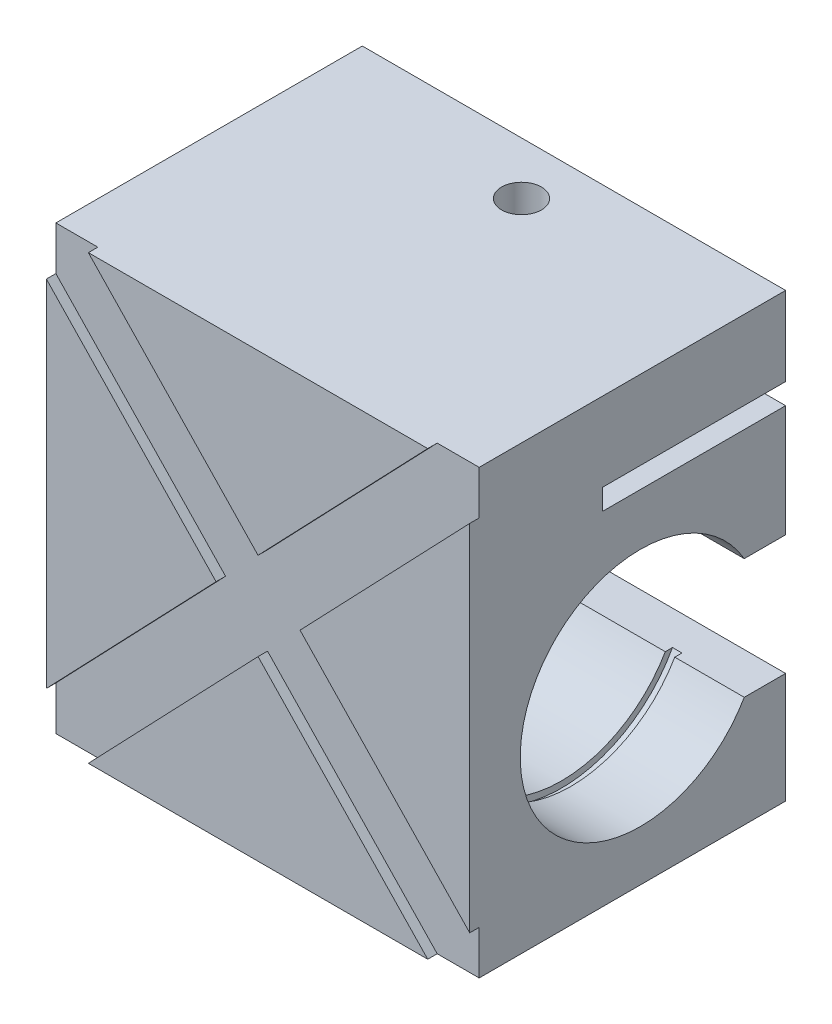
ISO-10303-21;
HEADER;
FILE_DESCRIPTION(('STEP AP214'),'2;1');
FILE_NAME('part.step','',(''),(''),'','','');
FILE_SCHEMA(('AUTOMOTIVE_DESIGN { 1 0 10303 214 1 1 1 1 }'));
ENDSEC;
DATA;
#1=APPLICATION_CONTEXT('core data for automotive mechanical design processes');
#2=APPLICATION_PROTOCOL_DEFINITION('international standard','automotive_design',2000,#1);
#3=PRODUCT_CONTEXT('',#1,'mechanical');
#4=PRODUCT('Part','Part','',(#3));
#5=PRODUCT_RELATED_PRODUCT_CATEGORY('part','',(#4));
#6=PRODUCT_DEFINITION_FORMATION('','',#4);
#7=PRODUCT_DEFINITION_CONTEXT('part definition',#1,'design');
#8=PRODUCT_DEFINITION('design','',#6,#7);
#9=PRODUCT_DEFINITION_SHAPE('','',#8);
#10=(LENGTH_UNIT() NAMED_UNIT(*) SI_UNIT(.MILLI.,.METRE.));
#11=(NAMED_UNIT(*) PLANE_ANGLE_UNIT() SI_UNIT($,.RADIAN.));
#12=(NAMED_UNIT(*) SI_UNIT($,.STERADIAN.) SOLID_ANGLE_UNIT());
#13=UNCERTAINTY_MEASURE_WITH_UNIT(LENGTH_MEASURE(1.E-05),#10,'distance_accuracy_value','');
#14=(GEOMETRIC_REPRESENTATION_CONTEXT(3) GLOBAL_UNCERTAINTY_ASSIGNED_CONTEXT((#13)) GLOBAL_UNIT_ASSIGNED_CONTEXT((#10,
#11,#12)) REPRESENTATION_CONTEXT('',''));
#15=CARTESIAN_POINT('',(0.,0.,0.));
#16=DIRECTION('',(0.,0.,1.));
#17=DIRECTION('',(1.,0.,0.));
#18=AXIS2_PLACEMENT_3D('',#15,#16,#17);
#19=CARTESIAN_POINT('',(0.,70.,0.));
#20=DIRECTION('',(1.,0.,0.));
#21=DIRECTION('',(0.,0.,-1.));
#22=AXIS2_PLACEMENT_3D('',#19,#20,#21);
#23=PLANE('',#22);
#24=DIRECTION('',(0.,-1.,0.));
#25=VECTOR('',#24,1.);
#26=CARTESIAN_POINT('',(0.,70.,0.));
#27=LINE('',#26,#25);
#28=CARTESIAN_POINT('',(0.,63.0581359493212,0.));
#29=VERTEX_POINT('',#28);
#30=CARTESIAN_POINT('',(0.,6.94186405067879,0.));
#31=VERTEX_POINT('',#30);
#32=EDGE_CURVE('E459',#29,#31,#27,.T.);
#33=ORIENTED_EDGE('',*,*,#32,.F.);
#34=DIRECTION('',(0.,0.,1.));
#35=VECTOR('',#34,1.);
#36=CARTESIAN_POINT('',(0.,63.0581359493212,-1.5));
#37=LINE('',#36,#35);
#38=CARTESIAN_POINT('',(0.,63.0581359493212,-1.5));
#39=VERTEX_POINT('',#38);
#40=EDGE_CURVE('E333',#39,#29,#37,.T.);
#41=ORIENTED_EDGE('',*,*,#40,.F.);
#42=DIRECTION('',(0.,-1.,0.));
#43=VECTOR('',#42,1.);
#44=CARTESIAN_POINT('',(0.,0.,-1.5));
#45=LINE('',#44,#43);
#46=CARTESIAN_POINT('',(0.,70.,-1.5));
#47=VERTEX_POINT('',#46);
#48=EDGE_CURVE('E282',#47,#39,#45,.T.);
#49=ORIENTED_EDGE('',*,*,#48,.F.);
#50=DIRECTION('',(0.,0.,1.));
#51=VECTOR('',#50,1.);
#52=CARTESIAN_POINT('',(0.,70.,0.));
#53=LINE('',#52,#51);
#54=CARTESIAN_POINT('',(0.,70.,-50.));
#55=VERTEX_POINT('',#54);
#56=EDGE_CURVE('E426',#55,#47,#53,.T.);
#57=ORIENTED_EDGE('',*,*,#56,.F.);
#58=DIRECTION('',(0.,-1.,0.));
#59=VECTOR('',#58,1.);
#60=CARTESIAN_POINT('',(0.,70.,-50.));
#61=LINE('',#60,#59);
#62=CARTESIAN_POINT('',(0.,57.5,-50.));
#63=VERTEX_POINT('',#62);
#64=EDGE_CURVE('E447',#55,#63,#61,.T.);
#65=ORIENTED_EDGE('',*,*,#64,.T.);
#66=DIRECTION('',(0.,0.,1.));
#67=VECTOR('',#66,1.);
#68=CARTESIAN_POINT('',(0.,57.5,0.));
#69=LINE('',#68,#67);
#70=CARTESIAN_POINT('',(0.,57.5,-21.));
#71=VERTEX_POINT('',#70);
#72=EDGE_CURVE('E388',#63,#71,#69,.T.);
#73=ORIENTED_EDGE('',*,*,#72,.T.);
#74=DIRECTION('',(0.,-1.,0.));
#75=VECTOR('',#74,1.);
#76=CARTESIAN_POINT('',(0.,70.,-21.));
#77=LINE('',#76,#75);
#78=CARTESIAN_POINT('',(0.,54.2,-21.));
#79=VERTEX_POINT('',#78);
#80=EDGE_CURVE('E395',#71,#79,#77,.T.);
#81=ORIENTED_EDGE('',*,*,#80,.T.);
#82=DIRECTION('',(0.,0.,-1.));
#83=VECTOR('',#82,1.);
#84=CARTESIAN_POINT('',(0.,54.2,0.));
#85=LINE('',#84,#83);
#86=CARTESIAN_POINT('',(0.,54.2,-50.));
#87=VERTEX_POINT('',#86);
#88=EDGE_CURVE('E392',#79,#87,#85,.T.);
#89=ORIENTED_EDGE('',*,*,#88,.T.);
#90=CARTESIAN_POINT('',(0.,36.5,-50.));
#91=VERTEX_POINT('',#90);
#92=EDGE_CURVE('E451',#87,#91,#61,.T.);
#93=ORIENTED_EDGE('',*,*,#92,.T.);
#94=DIRECTION('',(0.,0.,-1.));
#95=VECTOR('',#94,1.);
#96=CARTESIAN_POINT('',(0.,36.5,0.));
#97=LINE('',#96,#95);
#98=CARTESIAN_POINT('',(0.,36.5,-43.4544826719043));
#99=VERTEX_POINT('',#98);
#100=EDGE_CURVE('E419',#99,#91,#97,.T.);
#101=ORIENTED_EDGE('',*,*,#100,.F.);
#102=CARTESIAN_POINT('',(0.,27.,-27.));
#103=DIRECTION('',(1.,0.,0.));
#104=DIRECTION('',(0.,0.,-1.));
#105=AXIS2_PLACEMENT_3D('',#102,#103,#104);
#106=CIRCLE('',#105,19.);
#107=CARTESIAN_POINT('',(0.,17.5,-43.4544826719043));
#108=VERTEX_POINT('',#107);
#109=EDGE_CURVE('E422',#99,#108,#106,.T.);
#110=ORIENTED_EDGE('',*,*,#109,.T.);
#111=DIRECTION('',(0.,0.,-1.));
#112=VECTOR('',#111,1.);
#113=CARTESIAN_POINT('',(0.,17.5,0.));
#114=LINE('',#113,#112);
#115=CARTESIAN_POINT('',(0.,17.5,-50.));
#116=VERTEX_POINT('',#115);
#117=EDGE_CURVE('E410',#108,#116,#114,.T.);
#118=ORIENTED_EDGE('',*,*,#117,.T.);
#119=CARTESIAN_POINT('',(0.,0.,-50.));
#120=VERTEX_POINT('',#119);
#121=EDGE_CURVE('E437',#116,#120,#61,.T.);
#122=ORIENTED_EDGE('',*,*,#121,.T.);
#123=DIRECTION('',(0.,0.,1.));
#124=VECTOR('',#123,1.);
#125=CARTESIAN_POINT('',(0.,0.,0.));
#126=LINE('',#125,#124);
#127=CARTESIAN_POINT('',(0.,0.,-1.5));
#128=VERTEX_POINT('',#127);
#129=EDGE_CURVE('E425',#120,#128,#126,.T.);
#130=ORIENTED_EDGE('',*,*,#129,.T.);
#131=CARTESIAN_POINT('',(0.,6.94186405067879,-1.5));
#132=VERTEX_POINT('',#131);
#133=EDGE_CURVE('E51',#132,#128,#45,.T.);
#134=ORIENTED_EDGE('',*,*,#133,.F.);
#135=DIRECTION('',(0.,0.,1.));
#136=VECTOR('',#135,1.);
#137=CARTESIAN_POINT('',(0.,6.94186405067879,-1.5));
#138=LINE('',#137,#136);
#139=EDGE_CURVE('E328',#132,#31,#138,.T.);
#140=ORIENTED_EDGE('',*,*,#139,.T.);
#141=EDGE_LOOP('',(#33,#41,#49,#57,#65,#73,#81,#89,#93,#101,#110,#118,#122,#130,#134,#140));
#142=FACE_BOUND('',#141,.T.);
#143=ADVANCED_FACE('F37',(#142),#23,.F.);
#144=CARTESIAN_POINT('',(67.,70.,0.));
#145=DIRECTION('',(-1.,0.,0.));
#146=DIRECTION('',(0.,0.,1.));
#147=AXIS2_PLACEMENT_3D('',#144,#145,#146);
#148=PLANE('',#147);
#149=DIRECTION('',(0.,0.,1.));
#150=VECTOR('',#149,1.);
#151=CARTESIAN_POINT('',(67.,6.94186405067873,-1.5));
#152=LINE('',#151,#150);
#153=CARTESIAN_POINT('',(67.,6.94186405067873,-1.5));
#154=VERTEX_POINT('',#153);
#155=CARTESIAN_POINT('',(67.,6.94186405067873,0.));
#156=VERTEX_POINT('',#155);
#157=EDGE_CURVE('E318',#154,#156,#152,.T.);
#158=ORIENTED_EDGE('',*,*,#157,.F.);
#159=DIRECTION('',(0.,1.,0.));
#160=VECTOR('',#159,1.);
#161=CARTESIAN_POINT('',(67.,0.,-1.5));
#162=LINE('',#161,#160);
#163=CARTESIAN_POINT('',(67.,0.,-1.5));
#164=VERTEX_POINT('',#163);
#165=EDGE_CURVE('E256',#164,#154,#162,.T.);
#166=ORIENTED_EDGE('',*,*,#165,.F.);
#167=DIRECTION('',(0.,0.,-1.));
#168=VECTOR('',#167,1.);
#169=CARTESIAN_POINT('',(67.,0.,0.));
#170=LINE('',#169,#168);
#171=CARTESIAN_POINT('',(67.,0.,-50.));
#172=VERTEX_POINT('',#171);
#173=EDGE_CURVE('E443',#164,#172,#170,.T.);
#174=ORIENTED_EDGE('',*,*,#173,.T.);
#175=DIRECTION('',(0.,-1.,0.));
#176=VECTOR('',#175,1.);
#177=CARTESIAN_POINT('',(67.,70.,-50.));
#178=LINE('',#177,#176);
#179=CARTESIAN_POINT('',(67.,17.5,-50.));
#180=VERTEX_POINT('',#179);
#181=EDGE_CURVE('E450',#180,#172,#178,.T.);
#182=ORIENTED_EDGE('',*,*,#181,.F.);
#183=DIRECTION('',(0.,0.,-1.));
#184=VECTOR('',#183,1.);
#185=CARTESIAN_POINT('',(67.,17.5,0.));
#186=LINE('',#185,#184);
#187=CARTESIAN_POINT('',(67.,17.5,-43.4544826719043));
#188=VERTEX_POINT('',#187);
#189=EDGE_CURVE('E404',#188,#180,#186,.T.);
#190=ORIENTED_EDGE('',*,*,#189,.F.);
#191=CARTESIAN_POINT('',(67.,27.,-27.));
#192=DIRECTION('',(1.,0.,0.));
#193=DIRECTION('',(0.,0.,-1.));
#194=AXIS2_PLACEMENT_3D('',#191,#192,#193);
#195=CIRCLE('',#194,19.);
#196=CARTESIAN_POINT('',(67.,36.5,-43.4544826719043));
#197=VERTEX_POINT('',#196);
#198=EDGE_CURVE('E401',#197,#188,#195,.T.);
#199=ORIENTED_EDGE('',*,*,#198,.F.);
#200=DIRECTION('',(0.,0.,-1.));
#201=VECTOR('',#200,1.);
#202=CARTESIAN_POINT('',(67.,36.5,0.));
#203=LINE('',#202,#201);
#204=CARTESIAN_POINT('',(67.,36.5,-50.));
#205=VERTEX_POINT('',#204);
#206=EDGE_CURVE('E398',#197,#205,#203,.T.);
#207=ORIENTED_EDGE('',*,*,#206,.T.);
#208=CARTESIAN_POINT('',(67.,54.2,-50.));
#209=VERTEX_POINT('',#208);
#210=EDGE_CURVE('E456',#209,#205,#178,.T.);
#211=ORIENTED_EDGE('',*,*,#210,.F.);
#212=DIRECTION('',(0.,0.,-1.));
#213=VECTOR('',#212,1.);
#214=CARTESIAN_POINT('',(67.,54.2,-56.1986039492968));
#215=LINE('',#214,#213);
#216=CARTESIAN_POINT('',(67.,54.2,-21.));
#217=VERTEX_POINT('',#216);
#218=EDGE_CURVE('E383',#217,#209,#215,.T.);
#219=ORIENTED_EDGE('',*,*,#218,.F.);
#220=DIRECTION('',(0.,-1.,0.));
#221=VECTOR('',#220,1.);
#222=CARTESIAN_POINT('',(67.,57.5,-21.));
#223=LINE('',#222,#221);
#224=CARTESIAN_POINT('',(67.,57.5,-21.));
#225=VERTEX_POINT('',#224);
#226=EDGE_CURVE('E380',#225,#217,#223,.T.);
#227=ORIENTED_EDGE('',*,*,#226,.F.);
#228=DIRECTION('',(0.,0.,1.));
#229=VECTOR('',#228,1.);
#230=CARTESIAN_POINT('',(67.,57.5,-50.));
#231=LINE('',#230,#229);
#232=CARTESIAN_POINT('',(67.,57.5,-50.));
#233=VERTEX_POINT('',#232);
#234=EDGE_CURVE('E377',#233,#225,#231,.T.);
#235=ORIENTED_EDGE('',*,*,#234,.F.);
#236=CARTESIAN_POINT('',(67.,70.,-50.));
#237=VERTEX_POINT('',#236);
#238=EDGE_CURVE('E452',#237,#233,#178,.T.);
#239=ORIENTED_EDGE('',*,*,#238,.F.);
#240=DIRECTION('',(0.,0.,-1.));
#241=VECTOR('',#240,1.);
#242=CARTESIAN_POINT('',(67.,70.,0.));
#243=LINE('',#242,#241);
#244=CARTESIAN_POINT('',(67.,70.,-1.5));
#245=VERTEX_POINT('',#244);
#246=EDGE_CURVE('E433',#245,#237,#243,.T.);
#247=ORIENTED_EDGE('',*,*,#246,.F.);
#248=CARTESIAN_POINT('',(67.,63.0581359493212,-1.5));
#249=VERTEX_POINT('',#248);
#250=EDGE_CURVE('E268',#249,#245,#162,.T.);
#251=ORIENTED_EDGE('',*,*,#250,.F.);
#252=DIRECTION('',(0.,0.,1.));
#253=VECTOR('',#252,1.);
#254=CARTESIAN_POINT('',(67.,63.0581359493212,-1.5));
#255=LINE('',#254,#253);
#256=CARTESIAN_POINT('',(67.,63.0581359493212,0.));
#257=VERTEX_POINT('',#256);
#258=EDGE_CURVE('E255',#249,#257,#255,.T.);
#259=ORIENTED_EDGE('',*,*,#258,.T.);
#260=DIRECTION('',(0.,-1.,0.));
#261=VECTOR('',#260,1.);
#262=CARTESIAN_POINT('',(67.,70.,0.));
#263=LINE('',#262,#261);
#264=EDGE_CURVE('E455',#257,#156,#263,.T.);
#265=ORIENTED_EDGE('',*,*,#264,.T.);
#266=EDGE_LOOP('',(#158,#166,#174,#182,#190,#199,#207,#211,#219,#227,#235,#239,#247,#251,#259,#265));
#267=FACE_BOUND('',#266,.T.);
#268=ADVANCED_FACE('F559',(#267),#148,.F.);
#269=CARTESIAN_POINT('',(0.,70.,0.));
#270=DIRECTION('',(0.,0.,-1.));
#271=DIRECTION('',(-1.,0.,0.));
#272=AXIS2_PLACEMENT_3D('',#269,#270,#271);
#273=PLANE('',#272);
#274=DIRECTION('',(0.691456929285535,0.722417687313246,0.));
#275=VECTOR('',#274,1.);
#276=CARTESIAN_POINT('',(-3.46760489910358,3.31899326057057,0.));
#277=LINE('',#276,#275);
#278=CARTESIAN_POINT('',(26.855644408636,35.,0.));
#279=VERTEX_POINT('',#278);
#280=EDGE_CURVE('E311',#31,#279,#277,.T.);
#281=ORIENTED_EDGE('',*,*,#280,.T.);
#282=DIRECTION('',(0.691456929285535,-0.722417687313246,0.));
#283=VECTOR('',#282,1.);
#284=CARTESIAN_POINT('',(31.4988452020787,30.1488946934182,0.));
#285=LINE('',#284,#283);
#286=EDGE_CURVE('E308',#29,#279,#285,.T.);
#287=ORIENTED_EDGE('',*,*,#286,.F.);
#288=ORIENTED_EDGE('',*,*,#32,.T.);
#289=EDGE_LOOP('',(#281,#287,#288));
#290=FACE_BOUND('',#289,.T.);
#291=ADVANCED_FACE('F532',(#290),#273,.F.);
#292=DIRECTION('',(1.,0.,0.));
#293=VECTOR('',#292,1.);
#294=CARTESIAN_POINT('',(0.,0.,0.));
#295=LINE('',#294,#293);
#296=CARTESIAN_POINT('',(6.64435559136398,0.,0.));
#297=VERTEX_POINT('',#296);
#298=CARTESIAN_POINT('',(60.3556444086361,0.,0.));
#299=VERTEX_POINT('',#298);
#300=EDGE_CURVE('E440',#297,#299,#295,.T.);
#301=ORIENTED_EDGE('',*,*,#300,.T.);
#302=DIRECTION('',(0.691456929285535,-0.722417687313246,0.));
#303=VECTOR('',#302,1.);
#304=CARTESIAN_POINT('',(31.4988452020787,30.1488946934182,0.));
#305=LINE('',#304,#303);
#306=CARTESIAN_POINT('',(33.5,28.0581359493212,0.));
#307=VERTEX_POINT('',#306);
#308=EDGE_CURVE('E264',#307,#299,#305,.T.);
#309=ORIENTED_EDGE('',*,*,#308,.F.);
#310=DIRECTION('',(0.691456929285535,0.722417687313246,0.));
#311=VECTOR('',#310,1.);
#312=CARTESIAN_POINT('',(3.46760489910358,-3.31899326057057,0.));
#313=LINE('',#312,#311);
#314=EDGE_CURVE('E314',#297,#307,#313,.T.);
#315=ORIENTED_EDGE('',*,*,#314,.F.);
#316=EDGE_LOOP('',(#301,#309,#315));
#317=FACE_BOUND('',#316,.T.);
#318=ADVANCED_FACE('F589',(#317),#273,.F.);
#319=DIRECTION('',(0.691456929285535,-0.722417687313246,0.));
#320=VECTOR('',#319,1.);
#321=CARTESIAN_POINT('',(38.4340550002858,36.7868812145593,0.));
#322=LINE('',#321,#320);
#323=CARTESIAN_POINT('',(40.144355591364,35.,0.));
#324=VERTEX_POINT('',#323);
#325=EDGE_CURVE('E251',#324,#156,#322,.T.);
#326=ORIENTED_EDGE('',*,*,#325,.T.);
#327=ORIENTED_EDGE('',*,*,#264,.F.);
#328=DIRECTION('',(0.691456929285535,0.722417687313246,0.));
#329=VECTOR('',#328,1.);
#330=CARTESIAN_POINT('',(3.46760489910357,-3.31899326057057,0.));
#331=LINE('',#330,#329);
#332=EDGE_CURVE('E300',#324,#257,#331,.T.);
#333=ORIENTED_EDGE('',*,*,#332,.F.);
#334=EDGE_LOOP('',(#326,#327,#333));
#335=FACE_BOUND('',#334,.T.);
#336=ADVANCED_FACE('F593',(#335),#273,.F.);
#337=CARTESIAN_POINT('',(0.,70.,0.));
#338=DIRECTION('',(0.,-1.,0.));
#339=DIRECTION('',(0.,0.,-1.));
#340=AXIS2_PLACEMENT_3D('',#337,#338,#339);
#341=PLANE('',#340);
#342=CARTESIAN_POINT('',(33.5,70.,-41.7));
#343=DIRECTION('',(0.,1.,0.));
#344=DIRECTION('',(0.,0.,1.));
#345=AXIS2_PLACEMENT_3D('',#342,#343,#344);
#346=CIRCLE('',#345,3.15);
#347=CARTESIAN_POINT('',(33.5,70.,-38.55));
#348=VERTEX_POINT('',#347);
#349=EDGE_CURVE('E301',#348,#348,#346,.T.);
#350=ORIENTED_EDGE('',*,*,#349,.F.);
#351=EDGE_LOOP('',(#350));
#352=FACE_BOUND('',#351,.T.);
#353=DIRECTION('',(0.,0.,1.));
#354=VECTOR('',#353,1.);
#355=CARTESIAN_POINT('',(60.355644408636,70.,-1.5));
#356=LINE('',#355,#354);
#357=CARTESIAN_POINT('',(60.355644408636,70.,-1.5));
#358=VERTEX_POINT('',#357);
#359=CARTESIAN_POINT('',(60.355644408636,70.,0.));
#360=VERTEX_POINT('',#359);
#361=EDGE_CURVE('E340',#358,#360,#356,.T.);
#362=ORIENTED_EDGE('',*,*,#361,.F.);
#363=DIRECTION('',(-1.,0.,0.));
#364=VECTOR('',#363,1.);
#365=CARTESIAN_POINT('',(0.,70.,-1.5));
#366=LINE('',#365,#364);
#367=EDGE_CURVE('E270',#245,#358,#366,.T.);
#368=ORIENTED_EDGE('',*,*,#367,.F.);
#369=ORIENTED_EDGE('',*,*,#246,.T.);
#370=DIRECTION('',(-1.,0.,0.));
#371=VECTOR('',#370,1.);
#372=CARTESIAN_POINT('',(0.,70.,-50.));
#373=LINE('',#372,#371);
#374=EDGE_CURVE('E435',#237,#55,#373,.T.);
#375=ORIENTED_EDGE('',*,*,#374,.T.);
#376=ORIENTED_EDGE('',*,*,#56,.T.);
#377=CARTESIAN_POINT('',(6.64435559136394,70.,-1.5));
#378=VERTEX_POINT('',#377);
#379=EDGE_CURVE('E277',#378,#47,#366,.T.);
#380=ORIENTED_EDGE('',*,*,#379,.F.);
#381=DIRECTION('',(0.,0.,1.));
#382=VECTOR('',#381,1.);
#383=CARTESIAN_POINT('',(6.64435559136394,70.,-1.5));
#384=LINE('',#383,#382);
#385=CARTESIAN_POINT('',(6.64435559136394,70.,0.));
#386=VERTEX_POINT('',#385);
#387=EDGE_CURVE('E335',#378,#386,#384,.T.);
#388=ORIENTED_EDGE('',*,*,#387,.T.);
#389=DIRECTION('',(1.,0.,0.));
#390=VECTOR('',#389,1.);
#391=CARTESIAN_POINT('',(0.,70.,0.));
#392=LINE('',#391,#390);
#393=EDGE_CURVE('E429',#386,#360,#392,.T.);
#394=ORIENTED_EDGE('',*,*,#393,.T.);
#395=EDGE_LOOP('',(#362,#368,#369,#375,#376,#380,#388,#394));
#396=FACE_BOUND('',#395,.T.);
#397=ADVANCED_FACE('F541',(#352,#396),#341,.F.);
#398=CARTESIAN_POINT('',(-3.,27.,-27.));
#399=DIRECTION('',(1.,0.,0.));
#400=DIRECTION('',(0.,0.,-1.));
#401=AXIS2_PLACEMENT_3D('',#398,#399,#400);
#402=CYLINDRICAL_SURFACE('',#401,19.);
#403=CARTESIAN_POINT('',(11.,27.,-27.));
#404=DIRECTION('',(1.,0.,0.));
#405=DIRECTION('',(0.,0.,-1.));
#406=AXIS2_PLACEMENT_3D('',#403,#404,#405);
#407=CIRCLE('',#406,19.);
#408=CARTESIAN_POINT('',(11.,17.5,-43.4544826719043));
#409=VERTEX_POINT('',#408);
#410=CARTESIAN_POINT('',(11.,36.5,-43.4544826719043));
#411=VERTEX_POINT('',#410);
#412=EDGE_CURVE('E351',#409,#411,#407,.F.);
#413=ORIENTED_EDGE('',*,*,#412,.F.);
#414=DIRECTION('',(1.,0.,0.));
#415=VECTOR('',#414,1.);
#416=CARTESIAN_POINT('',(-3.,17.5,-43.4544826719043));
#417=LINE('',#416,#415);
#418=EDGE_CURVE('E407',#108,#409,#417,.T.);
#419=ORIENTED_EDGE('',*,*,#418,.F.);
#420=ORIENTED_EDGE('',*,*,#109,.F.);
#421=DIRECTION('',(1.,0.,0.));
#422=VECTOR('',#421,1.);
#423=CARTESIAN_POINT('',(-3.,36.5,-43.4544826719043));
#424=LINE('',#423,#422);
#425=EDGE_CURVE('E413',#99,#411,#424,.T.);
#426=ORIENTED_EDGE('',*,*,#425,.T.);
#427=EDGE_LOOP('',(#413,#419,#420,#426));
#428=FACE_BOUND('',#427,.T.);
#429=ADVANCED_FACE('F503',(#428),#402,.F.);
#430=CARTESIAN_POINT('',(-3.,36.5,0.));
#431=DIRECTION('',(0.,-1.,0.));
#432=DIRECTION('',(0.,0.,-1.));
#433=AXIS2_PLACEMENT_3D('',#430,#431,#432);
#434=PLANE('',#433);
#435=DIRECTION('',(1.,0.,0.));
#436=VECTOR('',#435,1.);
#437=CARTESIAN_POINT('',(11.,36.5,-44.599715906798));
#438=LINE('',#437,#436);
#439=CARTESIAN_POINT('',(11.,36.5,-44.599715906798));
#440=VERTEX_POINT('',#439);
#441=CARTESIAN_POINT('',(12.5,36.5,-44.599715906798));
#442=VERTEX_POINT('',#441);
#443=EDGE_CURVE('E356',#440,#442,#438,.T.);
#444=ORIENTED_EDGE('',*,*,#443,.F.);
#445=DIRECTION('',(0.,0.,1.));
#446=VECTOR('',#445,1.);
#447=CARTESIAN_POINT('',(11.,36.5,0.));
#448=LINE('',#447,#446);
#449=EDGE_CURVE('E353',#440,#411,#448,.T.);
#450=ORIENTED_EDGE('',*,*,#449,.T.);
#451=ORIENTED_EDGE('',*,*,#425,.F.);
#452=ORIENTED_EDGE('',*,*,#100,.T.);
#453=DIRECTION('',(1.,0.,0.));
#454=VECTOR('',#453,1.);
#455=CARTESIAN_POINT('',(0.,36.5,-50.));
#456=LINE('',#455,#454);
#457=EDGE_CURVE('E465',#91,#205,#456,.T.);
#458=ORIENTED_EDGE('',*,*,#457,.T.);
#459=ORIENTED_EDGE('',*,*,#206,.F.);
#460=CARTESIAN_POINT('',(56.,36.5,-43.4544826719043));
#461=VERTEX_POINT('',#460);
#462=EDGE_CURVE('E406',#461,#197,#424,.T.);
#463=ORIENTED_EDGE('',*,*,#462,.F.);
#464=DIRECTION('',(0.,0.,1.));
#465=VECTOR('',#464,1.);
#466=CARTESIAN_POINT('',(56.,36.5,0.));
#467=LINE('',#466,#465);
#468=CARTESIAN_POINT('',(56.,36.5,-44.599715906798));
#469=VERTEX_POINT('',#468);
#470=EDGE_CURVE('E372',#469,#461,#467,.T.);
#471=ORIENTED_EDGE('',*,*,#470,.F.);
#472=DIRECTION('',(-1.,0.,0.));
#473=VECTOR('',#472,1.);
#474=CARTESIAN_POINT('',(56.,36.5,-44.599715906798));
#475=LINE('',#474,#473);
#476=CARTESIAN_POINT('',(54.5,36.5,-44.599715906798));
#477=VERTEX_POINT('',#476);
#478=EDGE_CURVE('E374',#469,#477,#475,.T.);
#479=ORIENTED_EDGE('',*,*,#478,.T.);
#480=DIRECTION('',(0.,0.,1.));
#481=VECTOR('',#480,1.);
#482=CARTESIAN_POINT('',(54.5,36.5,0.));
#483=LINE('',#482,#481);
#484=CARTESIAN_POINT('',(54.5,36.5,-43.4544826719043));
#485=VERTEX_POINT('',#484);
#486=EDGE_CURVE('E366',#477,#485,#483,.T.);
#487=ORIENTED_EDGE('',*,*,#486,.T.);
#488=CARTESIAN_POINT('',(12.5,36.5,-43.4544826719043));
#489=VERTEX_POINT('',#488);
#490=EDGE_CURVE('E416',#489,#485,#424,.T.);
#491=ORIENTED_EDGE('',*,*,#490,.F.);
#492=DIRECTION('',(0.,0.,1.));
#493=VECTOR('',#492,1.);
#494=CARTESIAN_POINT('',(12.5,36.5,0.));
#495=LINE('',#494,#493);
#496=EDGE_CURVE('E349',#442,#489,#495,.T.);
#497=ORIENTED_EDGE('',*,*,#496,.F.);
#498=EDGE_LOOP('',(#444,#450,#451,#452,#458,#459,#463,#471,#479,#487,#491,#497));
#499=FACE_BOUND('',#498,.T.);
#500=ADVANCED_FACE('F499',(#499),#434,.T.);
#501=CARTESIAN_POINT('',(-3.,17.5,0.));
#502=DIRECTION('',(0.,-1.,0.));
#503=DIRECTION('',(0.,0.,-1.));
#504=AXIS2_PLACEMENT_3D('',#501,#502,#503);
#505=PLANE('',#504);
#506=DIRECTION('',(0.,0.,1.));
#507=VECTOR('',#506,1.);
#508=CARTESIAN_POINT('',(11.,17.5,0.));
#509=LINE('',#508,#507);
#510=CARTESIAN_POINT('',(11.,17.5,-44.599715906798));
#511=VERTEX_POINT('',#510);
#512=EDGE_CURVE('E11',#511,#409,#509,.T.);
#513=ORIENTED_EDGE('',*,*,#512,.F.);
#514=DIRECTION('',(1.,0.,0.));
#515=VECTOR('',#514,1.);
#516=CARTESIAN_POINT('',(11.,17.5,-44.599715906798));
#517=LINE('',#516,#515);
#518=CARTESIAN_POINT('',(12.5,17.5,-44.599715906798));
#519=VERTEX_POINT('',#518);
#520=EDGE_CURVE('E44',#511,#519,#517,.T.);
#521=ORIENTED_EDGE('',*,*,#520,.T.);
#522=DIRECTION('',(0.,0.,1.));
#523=VECTOR('',#522,1.);
#524=CARTESIAN_POINT('',(12.5,17.5,0.));
#525=LINE('',#524,#523);
#526=CARTESIAN_POINT('',(12.5,17.5,-43.4544826719043));
#527=VERTEX_POINT('',#526);
#528=EDGE_CURVE('E483',#519,#527,#525,.T.);
#529=ORIENTED_EDGE('',*,*,#528,.T.);
#530=CARTESIAN_POINT('',(54.5,17.5,-43.4544826719043));
#531=VERTEX_POINT('',#530);
#532=EDGE_CURVE('E411',#527,#531,#417,.T.);
#533=ORIENTED_EDGE('',*,*,#532,.T.);
#534=DIRECTION('',(0.,0.,1.));
#535=VECTOR('',#534,1.);
#536=CARTESIAN_POINT('',(54.5,17.5,0.));
#537=LINE('',#536,#535);
#538=CARTESIAN_POINT('',(54.5,17.5,-44.599715906798));
#539=VERTEX_POINT('',#538);
#540=EDGE_CURVE('E474',#539,#531,#537,.T.);
#541=ORIENTED_EDGE('',*,*,#540,.F.);
#542=DIRECTION('',(-1.,0.,0.));
#543=VECTOR('',#542,1.);
#544=CARTESIAN_POINT('',(56.,17.5,-44.599715906798));
#545=LINE('',#544,#543);
#546=CARTESIAN_POINT('',(56.,17.5,-44.599715906798));
#547=VERTEX_POINT('',#546);
#548=EDGE_CURVE('E477',#547,#539,#545,.T.);
#549=ORIENTED_EDGE('',*,*,#548,.F.);
#550=DIRECTION('',(0.,0.,1.));
#551=VECTOR('',#550,1.);
#552=CARTESIAN_POINT('',(56.,17.5,0.));
#553=LINE('',#552,#551);
#554=CARTESIAN_POINT('',(56.,17.5,-43.4544826719043));
#555=VERTEX_POINT('',#554);
#556=EDGE_CURVE('E480',#547,#555,#553,.T.);
#557=ORIENTED_EDGE('',*,*,#556,.T.);
#558=EDGE_CURVE('E412',#555,#188,#417,.T.);
#559=ORIENTED_EDGE('',*,*,#558,.T.);
#560=ORIENTED_EDGE('',*,*,#189,.T.);
#561=DIRECTION('',(1.,0.,0.));
#562=VECTOR('',#561,1.);
#563=CARTESIAN_POINT('',(0.,17.5,-50.));
#564=LINE('',#563,#562);
#565=EDGE_CURVE('E462',#116,#180,#564,.T.);
#566=ORIENTED_EDGE('',*,*,#565,.F.);
#567=ORIENTED_EDGE('',*,*,#117,.F.);
#568=ORIENTED_EDGE('',*,*,#418,.T.);
#569=EDGE_LOOP('',(#513,#521,#529,#533,#541,#549,#557,#559,#560,#566,#567,#568));
#570=FACE_BOUND('',#569,.T.);
#571=ADVANCED_FACE('F487',(#570),#505,.F.);
#572=ORIENTED_EDGE('',*,*,#532,.F.);
#573=CARTESIAN_POINT('',(12.5,27.,-27.));
#574=DIRECTION('',(1.,0.,0.));
#575=DIRECTION('',(0.,0.,-1.));
#576=AXIS2_PLACEMENT_3D('',#573,#574,#575);
#577=CIRCLE('',#576,19.);
#578=EDGE_CURVE('E59',#527,#489,#577,.F.);
#579=ORIENTED_EDGE('',*,*,#578,.T.);
#580=ORIENTED_EDGE('',*,*,#490,.T.);
#581=CARTESIAN_POINT('',(54.5,27.,-27.));
#582=DIRECTION('',(1.,0.,0.));
#583=DIRECTION('',(0.,0.,-1.));
#584=AXIS2_PLACEMENT_3D('',#581,#582,#583);
#585=CIRCLE('',#584,19.);
#586=EDGE_CURVE('E362',#531,#485,#585,.F.);
#587=ORIENTED_EDGE('',*,*,#586,.F.);
#588=EDGE_LOOP('',(#572,#579,#580,#587));
#589=FACE_BOUND('',#588,.T.);
#590=ADVANCED_FACE('F813',(#589),#402,.F.);
#591=CARTESIAN_POINT('',(0.,70.,-50.));
#592=DIRECTION('',(0.,0.,1.));
#593=DIRECTION('',(1.,0.,0.));
#594=AXIS2_PLACEMENT_3D('',#591,#592,#593);
#595=PLANE('',#594);
#596=ORIENTED_EDGE('',*,*,#92,.F.);
#597=DIRECTION('',(1.,0.,0.));
#598=VECTOR('',#597,1.);
#599=CARTESIAN_POINT('',(0.,54.2,-50.));
#600=LINE('',#599,#598);
#601=EDGE_CURVE('E471',#87,#209,#600,.T.);
#602=ORIENTED_EDGE('',*,*,#601,.T.);
#603=ORIENTED_EDGE('',*,*,#210,.T.);
#604=ORIENTED_EDGE('',*,*,#457,.F.);
#605=EDGE_LOOP('',(#596,#602,#603,#604));
#606=FACE_BOUND('',#605,.T.);
#607=ADVANCED_FACE('F512',(#606),#595,.F.);
#608=ORIENTED_EDGE('',*,*,#238,.T.);
#609=DIRECTION('',(-1.,0.,0.));
#610=VECTOR('',#609,1.);
#611=CARTESIAN_POINT('',(0.,57.5,-50.));
#612=LINE('',#611,#610);
#613=EDGE_CURVE('E468',#233,#63,#612,.T.);
#614=ORIENTED_EDGE('',*,*,#613,.T.);
#615=ORIENTED_EDGE('',*,*,#64,.F.);
#616=ORIENTED_EDGE('',*,*,#374,.F.);
#617=EDGE_LOOP('',(#608,#614,#615,#616));
#618=FACE_BOUND('',#617,.T.);
#619=ADVANCED_FACE('F548',(#618),#595,.F.);
#620=ORIENTED_EDGE('',*,*,#393,.F.);
#621=DIRECTION('',(-0.691456929285535,0.722417687313246,0.));
#622=VECTOR('',#621,1.);
#623=CARTESIAN_POINT('',(38.4340550002858,36.7868812145593,0.));
#624=LINE('',#623,#622);
#625=CARTESIAN_POINT('',(33.5,41.9418640506788,0.));
#626=VERTEX_POINT('',#625);
#627=EDGE_CURVE('E306',#626,#386,#624,.T.);
#628=ORIENTED_EDGE('',*,*,#627,.F.);
#629=DIRECTION('',(0.691456929285535,0.722417687313246,0.));
#630=VECTOR('',#629,1.);
#631=CARTESIAN_POINT('',(-3.46760489910358,3.31899326057057,0.));
#632=LINE('',#631,#630);
#633=EDGE_CURVE('E303',#626,#360,#632,.T.);
#634=ORIENTED_EDGE('',*,*,#633,.T.);
#635=EDGE_LOOP('',(#620,#628,#634));
#636=FACE_BOUND('',#635,.T.);
#637=ADVANCED_FACE('F568',(#636),#273,.F.);
#638=ORIENTED_EDGE('',*,*,#121,.F.);
#639=ORIENTED_EDGE('',*,*,#565,.T.);
#640=ORIENTED_EDGE('',*,*,#181,.T.);
#641=DIRECTION('',(-1.,0.,0.));
#642=VECTOR('',#641,1.);
#643=CARTESIAN_POINT('',(0.,0.,-50.));
#644=LINE('',#643,#642);
#645=EDGE_CURVE('E430',#172,#120,#644,.T.);
#646=ORIENTED_EDGE('',*,*,#645,.T.);
#647=EDGE_LOOP('',(#638,#639,#640,#646));
#648=FACE_BOUND('',#647,.T.);
#649=ADVANCED_FACE('F520',(#648),#595,.F.);
#650=CARTESIAN_POINT('',(0.,0.,0.));
#651=DIRECTION('',(0.,-1.,0.));
#652=DIRECTION('',(0.,0.,-1.));
#653=AXIS2_PLACEMENT_3D('',#650,#651,#652);
#654=PLANE('',#653);
#655=DIRECTION('',(0.,0.,1.));
#656=VECTOR('',#655,1.);
#657=CARTESIAN_POINT('',(60.3556444086361,0.,-1.5));
#658=LINE('',#657,#656);
#659=CARTESIAN_POINT('',(60.3556444086361,0.,-1.5));
#660=VERTEX_POINT('',#659);
#661=EDGE_CURVE('E321',#660,#299,#658,.T.);
#662=ORIENTED_EDGE('',*,*,#661,.T.);
#663=ORIENTED_EDGE('',*,*,#300,.F.);
#664=DIRECTION('',(0.,0.,1.));
#665=VECTOR('',#664,1.);
#666=CARTESIAN_POINT('',(6.64435559136398,0.,-1.5));
#667=LINE('',#666,#665);
#668=CARTESIAN_POINT('',(6.64435559136398,0.,-1.5));
#669=VERTEX_POINT('',#668);
#670=EDGE_CURVE('E326',#669,#297,#667,.T.);
#671=ORIENTED_EDGE('',*,*,#670,.F.);
#672=DIRECTION('',(1.,0.,0.));
#673=VECTOR('',#672,1.);
#674=CARTESIAN_POINT('',(0.,0.,-1.5));
#675=LINE('',#674,#673);
#676=EDGE_CURVE('E290',#128,#669,#675,.T.);
#677=ORIENTED_EDGE('',*,*,#676,.F.);
#678=ORIENTED_EDGE('',*,*,#129,.F.);
#679=ORIENTED_EDGE('',*,*,#645,.F.);
#680=ORIENTED_EDGE('',*,*,#173,.F.);
#681=EDGE_CURVE('E293',#660,#164,#675,.T.);
#682=ORIENTED_EDGE('',*,*,#681,.F.);
#683=EDGE_LOOP('',(#662,#663,#671,#677,#678,#679,#680,#682));
#684=FACE_BOUND('',#683,.T.);
#685=ADVANCED_FACE('F525',(#684),#654,.T.);
#686=ORIENTED_EDGE('',*,*,#558,.F.);
#687=CARTESIAN_POINT('',(56.,27.,-27.));
#688=DIRECTION('',(1.,0.,0.));
#689=DIRECTION('',(0.,0.,-1.));
#690=AXIS2_PLACEMENT_3D('',#687,#688,#689);
#691=CIRCLE('',#690,19.);
#692=EDGE_CURVE('E369',#555,#461,#691,.F.);
#693=ORIENTED_EDGE('',*,*,#692,.T.);
#694=ORIENTED_EDGE('',*,*,#462,.T.);
#695=ORIENTED_EDGE('',*,*,#198,.T.);
#696=EDGE_LOOP('',(#686,#693,#694,#695));
#697=FACE_BOUND('',#696,.T.);
#698=ADVANCED_FACE('F770',(#697),#402,.F.);
#699=CARTESIAN_POINT('',(-3.,57.5,-21.));
#700=DIRECTION('',(0.,0.,1.));
#701=DIRECTION('',(1.,0.,0.));
#702=AXIS2_PLACEMENT_3D('',#699,#700,#701);
#703=PLANE('',#702);
#704=DIRECTION('',(1.,0.,0.));
#705=VECTOR('',#704,1.);
#706=CARTESIAN_POINT('',(-3.,57.5,-21.));
#707=LINE('',#706,#705);
#708=EDGE_CURVE('E385',#71,#225,#707,.T.);
#709=ORIENTED_EDGE('',*,*,#708,.T.);
#710=ORIENTED_EDGE('',*,*,#226,.T.);
#711=DIRECTION('',(1.,0.,0.));
#712=VECTOR('',#711,1.);
#713=CARTESIAN_POINT('',(-3.,54.2,-21.));
#714=LINE('',#713,#712);
#715=EDGE_CURVE('E386',#79,#217,#714,.T.);
#716=ORIENTED_EDGE('',*,*,#715,.F.);
#717=ORIENTED_EDGE('',*,*,#80,.F.);
#718=EDGE_LOOP('',(#709,#710,#716,#717));
#719=FACE_BOUND('',#718,.T.);
#720=ADVANCED_FACE('F555',(#719),#703,.F.);
#721=CARTESIAN_POINT('',(-3.,54.2,-56.1986039492968));
#722=DIRECTION('',(0.,-1.,0.));
#723=DIRECTION('',(0.,0.,-1.));
#724=AXIS2_PLACEMENT_3D('',#721,#722,#723);
#725=PLANE('',#724);
#726=ORIENTED_EDGE('',*,*,#715,.T.);
#727=ORIENTED_EDGE('',*,*,#218,.T.);
#728=ORIENTED_EDGE('',*,*,#601,.F.);
#729=ORIENTED_EDGE('',*,*,#88,.F.);
#730=EDGE_LOOP('',(#726,#727,#728,#729));
#731=FACE_BOUND('',#730,.T.);
#732=ADVANCED_FACE('F558',(#731),#725,.F.);
#733=CARTESIAN_POINT('',(-3.,57.5,-50.));
#734=DIRECTION('',(0.,1.,0.));
#735=DIRECTION('',(0.,0.,1.));
#736=AXIS2_PLACEMENT_3D('',#733,#734,#735);
#737=PLANE('',#736);
#738=CARTESIAN_POINT('',(33.5,57.5,-41.7));
#739=DIRECTION('',(0.,1.,0.));
#740=DIRECTION('',(0.,0.,1.));
#741=AXIS2_PLACEMENT_3D('',#738,#739,#740);
#742=CIRCLE('',#741,3.15);
#743=CARTESIAN_POINT('',(33.5,57.5,-38.55));
#744=VERTEX_POINT('',#743);
#745=EDGE_CURVE('E702',#744,#744,#742,.F.);
#746=ORIENTED_EDGE('',*,*,#745,.F.);
#747=EDGE_LOOP('',(#746));
#748=FACE_BOUND('',#747,.T.);
#749=ORIENTED_EDGE('',*,*,#613,.F.);
#750=ORIENTED_EDGE('',*,*,#234,.T.);
#751=ORIENTED_EDGE('',*,*,#708,.F.);
#752=ORIENTED_EDGE('',*,*,#72,.F.);
#753=EDGE_LOOP('',(#749,#750,#751,#752));
#754=FACE_BOUND('',#753,.T.);
#755=ADVANCED_FACE('F551',(#748,#754),#737,.F.);
#756=CARTESIAN_POINT('',(56.,27.,-27.));
#757=DIRECTION('',(-1.,0.,0.));
#758=DIRECTION('',(0.,0.,1.));
#759=AXIS2_PLACEMENT_3D('',#756,#757,#758);
#760=CYLINDRICAL_SURFACE('',#759,20.);
#761=CARTESIAN_POINT('',(56.,27.,-27.));
#762=DIRECTION('',(1.,0.,0.));
#763=DIRECTION('',(0.,0.,-1.));
#764=AXIS2_PLACEMENT_3D('',#761,#762,#763);
#765=CIRCLE('',#764,20.);
#766=EDGE_CURVE('E359',#469,#547,#765,.T.);
#767=ORIENTED_EDGE('',*,*,#766,.T.);
#768=ORIENTED_EDGE('',*,*,#548,.T.);
#769=CARTESIAN_POINT('',(54.5,27.,-27.));
#770=DIRECTION('',(1.,0.,0.));
#771=DIRECTION('',(0.,0.,-1.));
#772=AXIS2_PLACEMENT_3D('',#769,#770,#771);
#773=CIRCLE('',#772,20.);
#774=EDGE_CURVE('E358',#477,#539,#773,.T.);
#775=ORIENTED_EDGE('',*,*,#774,.F.);
#776=ORIENTED_EDGE('',*,*,#478,.F.);
#777=EDGE_LOOP('',(#767,#768,#775,#776));
#778=FACE_BOUND('',#777,.T.);
#779=ADVANCED_FACE('F682',(#778),#760,.F.);
#780=CARTESIAN_POINT('',(56.,27.,-27.));
#781=DIRECTION('',(1.,0.,0.));
#782=DIRECTION('',(0.,0.,-1.));
#783=AXIS2_PLACEMENT_3D('',#780,#781,#782);
#784=PLANE('',#783);
#785=ORIENTED_EDGE('',*,*,#470,.T.);
#786=ORIENTED_EDGE('',*,*,#692,.F.);
#787=ORIENTED_EDGE('',*,*,#556,.F.);
#788=ORIENTED_EDGE('',*,*,#766,.F.);
#789=EDGE_LOOP('',(#785,#786,#787,#788));
#790=FACE_BOUND('',#789,.T.);
#791=ADVANCED_FACE('F710',(#790),#784,.F.);
#792=CARTESIAN_POINT('',(54.5,27.,-27.));
#793=DIRECTION('',(1.,0.,0.));
#794=DIRECTION('',(0.,0.,-1.));
#795=AXIS2_PLACEMENT_3D('',#792,#793,#794);
#796=PLANE('',#795);
#797=ORIENTED_EDGE('',*,*,#774,.T.);
#798=ORIENTED_EDGE('',*,*,#540,.T.);
#799=ORIENTED_EDGE('',*,*,#586,.T.);
#800=ORIENTED_EDGE('',*,*,#486,.F.);
#801=EDGE_LOOP('',(#797,#798,#799,#800));
#802=FACE_BOUND('',#801,.T.);
#803=ADVANCED_FACE('F719',(#802),#796,.T.);
#804=CARTESIAN_POINT('',(11.,27.,-27.));
#805=DIRECTION('',(1.,0.,0.));
#806=DIRECTION('',(0.,0.,-1.));
#807=AXIS2_PLACEMENT_3D('',#804,#805,#806);
#808=CYLINDRICAL_SURFACE('',#807,20.);
#809=ORIENTED_EDGE('',*,*,#443,.T.);
#810=CARTESIAN_POINT('',(12.5,27.,-27.));
#811=DIRECTION('',(1.,0.,0.));
#812=DIRECTION('',(0.,0.,-1.));
#813=AXIS2_PLACEMENT_3D('',#810,#811,#812);
#814=CIRCLE('',#813,20.);
#815=EDGE_CURVE('E320',#442,#519,#814,.T.);
#816=ORIENTED_EDGE('',*,*,#815,.T.);
#817=ORIENTED_EDGE('',*,*,#520,.F.);
#818=CARTESIAN_POINT('',(11.,27.,-27.));
#819=DIRECTION('',(1.,0.,0.));
#820=DIRECTION('',(0.,0.,-1.));
#821=AXIS2_PLACEMENT_3D('',#818,#819,#820);
#822=CIRCLE('',#821,20.);
#823=EDGE_CURVE('E343',#440,#511,#822,.T.);
#824=ORIENTED_EDGE('',*,*,#823,.F.);
#825=EDGE_LOOP('',(#809,#816,#817,#824));
#826=FACE_BOUND('',#825,.T.);
#827=ADVANCED_FACE('F491',(#826),#808,.F.);
#828=CARTESIAN_POINT('',(11.,27.,-27.));
#829=DIRECTION('',(1.,0.,0.));
#830=DIRECTION('',(0.,0.,-1.));
#831=AXIS2_PLACEMENT_3D('',#828,#829,#830);
#832=PLANE('',#831);
#833=ORIENTED_EDGE('',*,*,#823,.T.);
#834=ORIENTED_EDGE('',*,*,#512,.T.);
#835=ORIENTED_EDGE('',*,*,#412,.T.);
#836=ORIENTED_EDGE('',*,*,#449,.F.);
#837=EDGE_LOOP('',(#833,#834,#835,#836));
#838=FACE_BOUND('',#837,.T.);
#839=ADVANCED_FACE('F495',(#838),#832,.T.);
#840=CARTESIAN_POINT('',(12.5,27.,-27.));
#841=DIRECTION('',(1.,0.,0.));
#842=DIRECTION('',(0.,0.,-1.));
#843=AXIS2_PLACEMENT_3D('',#840,#841,#842);
#844=PLANE('',#843);
#845=ORIENTED_EDGE('',*,*,#496,.T.);
#846=ORIENTED_EDGE('',*,*,#578,.F.);
#847=ORIENTED_EDGE('',*,*,#528,.F.);
#848=ORIENTED_EDGE('',*,*,#815,.F.);
#849=EDGE_LOOP('',(#845,#846,#847,#848));
#850=FACE_BOUND('',#849,.T.);
#851=ADVANCED_FACE('F622',(#850),#844,.F.);
#852=CARTESIAN_POINT('',(38.4340550002858,36.7868812145593,-1.5));
#853=DIRECTION('',(-0.722417687313246,-0.691456929285535,0.));
#854=DIRECTION('',(0.691456929285535,-0.722417687313246,0.));
#855=AXIS2_PLACEMENT_3D('',#852,#853,#854);
#856=PLANE('',#855);
#857=ORIENTED_EDGE('',*,*,#325,.F.);
#858=DIRECTION('',(0.,0.,1.));
#859=VECTOR('',#858,1.);
#860=CARTESIAN_POINT('',(40.144355591364,35.,-1.5));
#861=LINE('',#860,#859);
#862=CARTESIAN_POINT('',(40.144355591364,35.,-1.5));
#863=VERTEX_POINT('',#862);
#864=EDGE_CURVE('E245',#863,#324,#861,.T.);
#865=ORIENTED_EDGE('',*,*,#864,.F.);
#866=DIRECTION('',(0.691456929285535,-0.722417687313246,0.));
#867=VECTOR('',#866,1.);
#868=CARTESIAN_POINT('',(38.4340550002858,36.7868812145593,-1.5));
#869=LINE('',#868,#867);
#870=EDGE_CURVE('E248',#863,#154,#869,.T.);
#871=ORIENTED_EDGE('',*,*,#870,.T.);
#872=ORIENTED_EDGE('',*,*,#157,.T.);
#873=EDGE_LOOP('',(#857,#865,#871,#872));
#874=FACE_BOUND('',#873,.T.);
#875=ADVANCED_FACE('F247',(#874),#856,.T.);
#876=CARTESIAN_POINT('',(31.4988452020787,30.1488946934182,-1.5));
#877=DIRECTION('',(-0.722417687313246,-0.691456929285535,0.));
#878=DIRECTION('',(0.691456929285535,-0.722417687313246,0.));
#879=AXIS2_PLACEMENT_3D('',#876,#877,#878);
#880=PLANE('',#879);
#881=ORIENTED_EDGE('',*,*,#308,.T.);
#882=ORIENTED_EDGE('',*,*,#661,.F.);
#883=DIRECTION('',(0.691456929285535,-0.722417687313246,0.));
#884=VECTOR('',#883,1.);
#885=CARTESIAN_POINT('',(31.4988452020787,30.1488946934182,-1.5));
#886=LINE('',#885,#884);
#887=CARTESIAN_POINT('',(33.5,28.0581359493212,-1.5));
#888=VERTEX_POINT('',#887);
#889=EDGE_CURVE('E296',#888,#660,#886,.T.);
#890=ORIENTED_EDGE('',*,*,#889,.F.);
#891=DIRECTION('',(0.,0.,1.));
#892=VECTOR('',#891,1.);
#893=CARTESIAN_POINT('',(33.5,28.0581359493212,-1.5));
#894=LINE('',#893,#892);
#895=EDGE_CURVE('E324',#888,#307,#894,.T.);
#896=ORIENTED_EDGE('',*,*,#895,.T.);
#897=EDGE_LOOP('',(#881,#882,#890,#896));
#898=FACE_BOUND('',#897,.T.);
#899=ADVANCED_FACE('F614',(#898),#880,.F.);
#900=CARTESIAN_POINT('',(3.46760489910358,-3.31899326057057,-1.5));
#901=DIRECTION('',(0.722417687313246,-0.691456929285535,0.));
#902=DIRECTION('',(0.691456929285535,0.722417687313246,0.));
#903=AXIS2_PLACEMENT_3D('',#900,#901,#902);
#904=PLANE('',#903);
#905=ORIENTED_EDGE('',*,*,#314,.T.);
#906=ORIENTED_EDGE('',*,*,#895,.F.);
#907=DIRECTION('',(0.691456929285535,0.722417687313246,0.));
#908=VECTOR('',#907,1.);
#909=CARTESIAN_POINT('',(3.46760489910358,-3.31899326057057,-1.5));
#910=LINE('',#909,#908);
#911=EDGE_CURVE('E292',#669,#888,#910,.T.);
#912=ORIENTED_EDGE('',*,*,#911,.F.);
#913=ORIENTED_EDGE('',*,*,#670,.T.);
#914=EDGE_LOOP('',(#905,#906,#912,#913));
#915=FACE_BOUND('',#914,.T.);
#916=ADVANCED_FACE('F613',(#915),#904,.F.);
#917=CARTESIAN_POINT('',(-3.46760489910358,3.31899326057057,-1.5));
#918=DIRECTION('',(0.722417687313246,-0.691456929285535,0.));
#919=DIRECTION('',(0.691456929285535,0.722417687313246,0.));
#920=AXIS2_PLACEMENT_3D('',#917,#918,#919);
#921=PLANE('',#920);
#922=ORIENTED_EDGE('',*,*,#280,.F.);
#923=ORIENTED_EDGE('',*,*,#139,.F.);
#924=DIRECTION('',(0.691456929285535,0.722417687313246,0.));
#925=VECTOR('',#924,1.);
#926=CARTESIAN_POINT('',(-3.46760489910358,3.31899326057057,-1.5));
#927=LINE('',#926,#925);
#928=CARTESIAN_POINT('',(26.855644408636,35.,-1.5));
#929=VERTEX_POINT('',#928);
#930=EDGE_CURVE('E288',#132,#929,#927,.T.);
#931=ORIENTED_EDGE('',*,*,#930,.T.);
#932=DIRECTION('',(0.,0.,1.));
#933=VECTOR('',#932,1.);
#934=CARTESIAN_POINT('',(26.855644408636,35.,-1.5));
#935=LINE('',#934,#933);
#936=EDGE_CURVE('E331',#929,#279,#935,.T.);
#937=ORIENTED_EDGE('',*,*,#936,.T.);
#938=EDGE_LOOP('',(#922,#923,#931,#937));
#939=FACE_BOUND('',#938,.T.);
#940=ADVANCED_FACE('F579',(#939),#921,.T.);
#941=CARTESIAN_POINT('',(31.4988452020787,30.1488946934182,-1.5));
#942=DIRECTION('',(-0.722417687313245,-0.691456929285535,0.));
#943=DIRECTION('',(0.691456929285535,-0.722417687313246,0.));
#944=AXIS2_PLACEMENT_3D('',#941,#942,#943);
#945=PLANE('',#944);
#946=ORIENTED_EDGE('',*,*,#286,.T.);
#947=ORIENTED_EDGE('',*,*,#936,.F.);
#948=DIRECTION('',(0.691456929285535,-0.722417687313246,0.));
#949=VECTOR('',#948,1.);
#950=CARTESIAN_POINT('',(31.4988452020787,30.1488946934182,-1.5));
#951=LINE('',#950,#949);
#952=EDGE_CURVE('E285',#39,#929,#951,.T.);
#953=ORIENTED_EDGE('',*,*,#952,.F.);
#954=ORIENTED_EDGE('',*,*,#40,.T.);
#955=EDGE_LOOP('',(#946,#947,#953,#954));
#956=FACE_BOUND('',#955,.T.);
#957=ADVANCED_FACE('F535',(#956),#945,.F.);
#958=CARTESIAN_POINT('',(38.4340550002858,36.7868812145593,-1.5));
#959=DIRECTION('',(0.722417687313245,0.691456929285535,0.));
#960=DIRECTION('',(-0.691456929285535,0.722417687313245,0.));
#961=AXIS2_PLACEMENT_3D('',#958,#959,#960);
#962=PLANE('',#961);
#963=ORIENTED_EDGE('',*,*,#627,.T.);
#964=ORIENTED_EDGE('',*,*,#387,.F.);
#965=DIRECTION('',(-0.691456929285535,0.722417687313246,0.));
#966=VECTOR('',#965,1.);
#967=CARTESIAN_POINT('',(38.4340550002858,36.7868812145593,-1.5));
#968=LINE('',#967,#966);
#969=CARTESIAN_POINT('',(33.5,41.9418640506788,-1.5));
#970=VERTEX_POINT('',#969);
#971=EDGE_CURVE('E279',#970,#378,#968,.T.);
#972=ORIENTED_EDGE('',*,*,#971,.F.);
#973=DIRECTION('',(0.,0.,1.));
#974=VECTOR('',#973,1.);
#975=CARTESIAN_POINT('',(33.5,41.9418640506788,-1.5));
#976=LINE('',#975,#974);
#977=EDGE_CURVE('E338',#970,#626,#976,.T.);
#978=ORIENTED_EDGE('',*,*,#977,.T.);
#979=EDGE_LOOP('',(#963,#964,#972,#978));
#980=FACE_BOUND('',#979,.T.);
#981=ADVANCED_FACE('F570',(#980),#962,.F.);
#982=CARTESIAN_POINT('',(-3.46760489910358,3.31899326057057,-1.5));
#983=DIRECTION('',(0.722417687313246,-0.691456929285535,0.));
#984=DIRECTION('',(0.691456929285535,0.722417687313246,0.));
#985=AXIS2_PLACEMENT_3D('',#982,#983,#984);
#986=PLANE('',#985);
#987=ORIENTED_EDGE('',*,*,#633,.F.);
#988=ORIENTED_EDGE('',*,*,#977,.F.);
#989=DIRECTION('',(0.691456929285535,0.722417687313246,0.));
#990=VECTOR('',#989,1.);
#991=CARTESIAN_POINT('',(-3.46760489910358,3.31899326057057,-1.5));
#992=LINE('',#991,#990);
#993=EDGE_CURVE('E276',#970,#358,#992,.T.);
#994=ORIENTED_EDGE('',*,*,#993,.T.);
#995=ORIENTED_EDGE('',*,*,#361,.T.);
#996=EDGE_LOOP('',(#987,#988,#994,#995));
#997=FACE_BOUND('',#996,.T.);
#998=ADVANCED_FACE('F565',(#997),#986,.T.);
#999=CARTESIAN_POINT('',(3.46760489910357,-3.31899326057057,-1.5));
#1000=DIRECTION('',(0.722417687313246,-0.691456929285535,0.));
#1001=DIRECTION('',(0.691456929285535,0.722417687313246,0.));
#1002=AXIS2_PLACEMENT_3D('',#999,#1000,#1001);
#1003=PLANE('',#1002);
#1004=ORIENTED_EDGE('',*,*,#332,.T.);
#1005=ORIENTED_EDGE('',*,*,#258,.F.);
#1006=DIRECTION('',(0.691456929285535,0.722417687313246,0.));
#1007=VECTOR('',#1006,1.);
#1008=CARTESIAN_POINT('',(3.46760489910357,-3.31899326057057,-1.5));
#1009=LINE('',#1008,#1007);
#1010=EDGE_CURVE('E260',#863,#249,#1009,.T.);
#1011=ORIENTED_EDGE('',*,*,#1010,.F.);
#1012=ORIENTED_EDGE('',*,*,#864,.T.);
#1013=EDGE_LOOP('',(#1004,#1005,#1011,#1012));
#1014=FACE_BOUND('',#1013,.T.);
#1015=ADVANCED_FACE('F266',(#1014),#1003,.F.);
#1016=CARTESIAN_POINT('',(0.,0.,-1.5));
#1017=DIRECTION('',(0.,0.,1.));
#1018=DIRECTION('',(1.,0.,0.));
#1019=AXIS2_PLACEMENT_3D('',#1016,#1017,#1018);
#1020=PLANE('',#1019);
#1021=ORIENTED_EDGE('',*,*,#870,.F.);
#1022=ORIENTED_EDGE('',*,*,#1010,.T.);
#1023=ORIENTED_EDGE('',*,*,#250,.T.);
#1024=ORIENTED_EDGE('',*,*,#367,.T.);
#1025=ORIENTED_EDGE('',*,*,#993,.F.);
#1026=ORIENTED_EDGE('',*,*,#971,.T.);
#1027=ORIENTED_EDGE('',*,*,#379,.T.);
#1028=ORIENTED_EDGE('',*,*,#48,.T.);
#1029=ORIENTED_EDGE('',*,*,#952,.T.);
#1030=ORIENTED_EDGE('',*,*,#930,.F.);
#1031=ORIENTED_EDGE('',*,*,#133,.T.);
#1032=ORIENTED_EDGE('',*,*,#676,.T.);
#1033=ORIENTED_EDGE('',*,*,#911,.T.);
#1034=ORIENTED_EDGE('',*,*,#889,.T.);
#1035=ORIENTED_EDGE('',*,*,#681,.T.);
#1036=ORIENTED_EDGE('',*,*,#165,.T.);
#1037=EDGE_LOOP('',(#1021,#1022,#1023,#1024,#1025,#1026,#1027,#1028,#1029,#1030,#1031,#1032,
#1033,#1034,#1035,#1036));
#1038=FACE_BOUND('',#1037,.T.);
#1039=ADVANCED_FACE('F259',(#1038),#1020,.T.);
#1040=CARTESIAN_POINT('',(33.5,-0.001000000000001,-41.7));
#1041=DIRECTION('',(0.,1.,0.));
#1042=DIRECTION('',(0.,0.,1.));
#1043=AXIS2_PLACEMENT_3D('',#1040,#1041,#1042);
#1044=CYLINDRICAL_SURFACE('',#1043,3.15);
#1045=ORIENTED_EDGE('',*,*,#349,.T.);
#1046=EDGE_LOOP('',(#1045));
#1047=FACE_BOUND('',#1046,.T.);
#1048=ORIENTED_EDGE('',*,*,#745,.T.);
#1049=EDGE_LOOP('',(#1048));
#1050=FACE_BOUND('',#1049,.T.);
#1051=ADVANCED_FACE('F663',(#1047,#1050),#1044,.F.);
#1052=CLOSED_SHELL('',(#143,#268,#291,#318,#336,#397,#429,#500,#571,#590,#607,#619,#637,#649,
#685,#698,#720,#732,#755,#779,#791,#803,#827,#839,#851,#875,#899,#916,#940,#957,#981,#998,#1015,
#1039,#1051));
#1053=MANIFOLD_SOLID_BREP('B2',#1052);
#1054=ADVANCED_BREP_SHAPE_REPRESENTATION('',(#18,#1053),#14);
#1055=SHAPE_DEFINITION_REPRESENTATION(#9,#1054);
ENDSEC;
END-ISO-10303-21;
